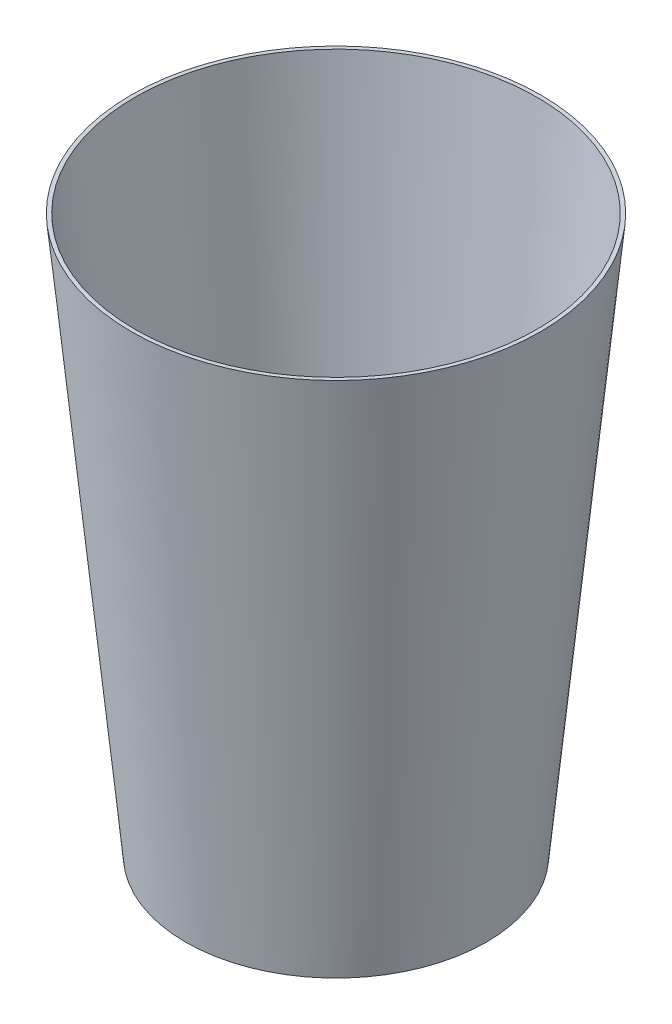
ISO-10303-21;
HEADER;
FILE_DESCRIPTION(('STEP AP214'),'2;1');
FILE_NAME('part.step','',(''),(''),'','','');
FILE_SCHEMA(('AUTOMOTIVE_DESIGN { 1 0 10303 214 1 1 1 1 }'));
ENDSEC;
DATA;
#1=APPLICATION_CONTEXT('core data for automotive mechanical design processes');
#2=APPLICATION_PROTOCOL_DEFINITION('international standard','automotive_design',2000,#1);
#3=PRODUCT_CONTEXT('',#1,'mechanical');
#4=PRODUCT('Part','Part','',(#3));
#5=PRODUCT_RELATED_PRODUCT_CATEGORY('part','',(#4));
#6=PRODUCT_DEFINITION_FORMATION('','',#4);
#7=PRODUCT_DEFINITION_CONTEXT('part definition',#1,'design');
#8=PRODUCT_DEFINITION('design','',#6,#7);
#9=PRODUCT_DEFINITION_SHAPE('','',#8);
#10=(LENGTH_UNIT() NAMED_UNIT(*) SI_UNIT(.MILLI.,.METRE.));
#11=(NAMED_UNIT(*) PLANE_ANGLE_UNIT() SI_UNIT($,.RADIAN.));
#12=(NAMED_UNIT(*) SI_UNIT($,.STERADIAN.) SOLID_ANGLE_UNIT());
#13=UNCERTAINTY_MEASURE_WITH_UNIT(LENGTH_MEASURE(1.E-05),#10,'distance_accuracy_value','');
#14=(GEOMETRIC_REPRESENTATION_CONTEXT(3) GLOBAL_UNCERTAINTY_ASSIGNED_CONTEXT((#13)) GLOBAL_UNIT_ASSIGNED_CONTEXT((#10,
#11,#12)) REPRESENTATION_CONTEXT('',''));
#15=CARTESIAN_POINT('',(0.,0.,0.));
#16=DIRECTION('',(0.,0.,1.));
#17=DIRECTION('',(1.,0.,0.));
#18=AXIS2_PLACEMENT_3D('',#15,#16,#17);
#19=CARTESIAN_POINT('',(0.,0.,0.));
#20=DIRECTION('',(0.,1.,0.));
#21=DIRECTION('',(0.,0.,1.));
#22=AXIS2_PLACEMENT_3D('',#19,#20,#21);
#23=CONICAL_SURFACE('',#22,35.,0.0975289986014434);
#24=CARTESIAN_POINT('',(0.,-95.,0.));
#25=DIRECTION('',(0.,1.,0.));
#26=DIRECTION('',(0.,0.,1.));
#27=AXIS2_PLACEMENT_3D('',#24,#25,#26);
#28=CIRCLE('',#27,25.705256186228);
#29=CARTESIAN_POINT('',(0.,-95.,25.705256186228));
#30=VERTEX_POINT('',#29);
#31=EDGE_CURVE('E11',#30,#30,#28,.T.);
#32=ORIENTED_EDGE('',*,*,#31,.T.);
#33=EDGE_LOOP('',(#32));
#34=FACE_BOUND('',#33,.T.);
#35=CARTESIAN_POINT('',(0.,0.,0.));
#36=DIRECTION('',(0.,1.,0.));
#37=DIRECTION('',(0.,0.,1.));
#38=AXIS2_PLACEMENT_3D('',#35,#36,#37);
#39=CIRCLE('',#38,35.);
#40=CARTESIAN_POINT('',(0.,0.,35.));
#41=VERTEX_POINT('',#40);
#42=EDGE_CURVE('E50',#41,#41,#39,.T.);
#43=ORIENTED_EDGE('',*,*,#42,.F.);
#44=EDGE_LOOP('',(#43));
#45=FACE_BOUND('',#44,.T.);
#46=ADVANCED_FACE('F43',(#34,#45),#23,.T.);
#47=CARTESIAN_POINT('',(0.,-95.,0.));
#48=DIRECTION('',(0.,1.,0.));
#49=DIRECTION('',(0.,0.,1.));
#50=AXIS2_PLACEMENT_3D('',#47,#48,#49);
#51=PLANE('',#50);
#52=ORIENTED_EDGE('',*,*,#31,.F.);
#53=EDGE_LOOP('',(#52));
#54=FACE_BOUND('',#53,.T.);
#55=ADVANCED_FACE('F71',(#54),#51,.F.);
#56=CARTESIAN_POINT('',(0.,0.,0.));
#57=DIRECTION('',(0.,1.,0.));
#58=DIRECTION('',(0.,0.,1.));
#59=AXIS2_PLACEMENT_3D('',#56,#57,#58);
#60=PLANE('',#59);
#61=CARTESIAN_POINT('',(0.,0.,0.));
#62=DIRECTION('',(0.,1.,0.));
#63=DIRECTION('',(0.,0.,1.));
#64=AXIS2_PLACEMENT_3D('',#61,#62,#63);
#65=CIRCLE('',#64,34.35);
#66=CARTESIAN_POINT('',(0.,0.,34.35));
#67=VERTEX_POINT('',#66);
#68=EDGE_CURVE('E60',#67,#67,#65,.T.);
#69=ORIENTED_EDGE('',*,*,#68,.F.);
#70=EDGE_LOOP('',(#69));
#71=FACE_BOUND('',#70,.T.);
#72=ORIENTED_EDGE('',*,*,#42,.T.);
#73=EDGE_LOOP('',(#72));
#74=FACE_BOUND('',#73,.T.);
#75=ADVANCED_FACE('F69',(#71,#74),#60,.T.);
#76=CARTESIAN_POINT('',(0.,0.,0.));
#77=DIRECTION('',(0.,1.,0.));
#78=DIRECTION('',(0.,0.,1.));
#79=AXIS2_PLACEMENT_3D('',#76,#77,#78);
#80=CONICAL_SURFACE('',#79,34.35,0.0975289986014434);
#81=CARTESIAN_POINT('',(0.,-94.35,0.));
#82=DIRECTION('',(0.,1.,0.));
#83=DIRECTION('',(0.,0.,1.));
#84=AXIS2_PLACEMENT_3D('',#81,#82,#83);
#85=CIRCLE('',#84,25.1188518017959);
#86=CARTESIAN_POINT('',(0.,-94.35,25.1188518017959));
#87=VERTEX_POINT('',#86);
#88=EDGE_CURVE('E55',#87,#87,#85,.F.);
#89=ORIENTED_EDGE('',*,*,#88,.T.);
#90=EDGE_LOOP('',(#89));
#91=FACE_BOUND('',#90,.T.);
#92=ORIENTED_EDGE('',*,*,#68,.T.);
#93=EDGE_LOOP('',(#92));
#94=FACE_BOUND('',#93,.T.);
#95=ADVANCED_FACE('F67',(#91,#94),#80,.F.);
#96=CARTESIAN_POINT('',(0.,-94.35,0.));
#97=DIRECTION('',(0.,1.,0.));
#98=DIRECTION('',(0.,0.,1.));
#99=AXIS2_PLACEMENT_3D('',#96,#97,#98);
#100=PLANE('',#99);
#101=ORIENTED_EDGE('',*,*,#88,.F.);
#102=EDGE_LOOP('',(#101));
#103=FACE_BOUND('',#102,.T.);
#104=ADVANCED_FACE('F76',(#103),#100,.T.);
#105=CLOSED_SHELL('',(#46,#55,#75,#95,#104));
#106=MANIFOLD_SOLID_BREP('B2',#105);
#107=ADVANCED_BREP_SHAPE_REPRESENTATION('',(#18,#106),#14);
#108=SHAPE_DEFINITION_REPRESENTATION(#9,#107);
ENDSEC;
END-ISO-10303-21;
